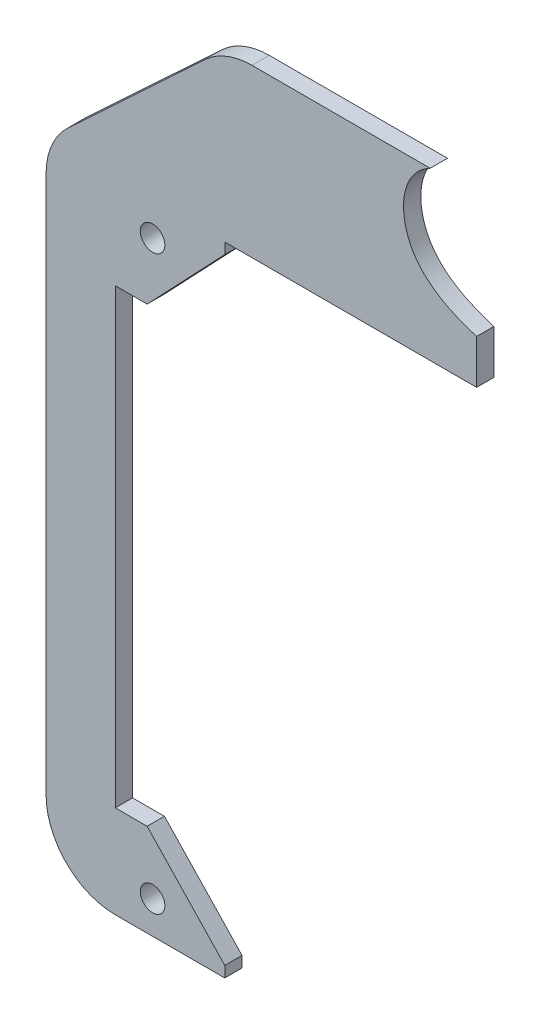
ISO-10303-21;
HEADER;
FILE_DESCRIPTION(('STEP AP214'),'2;1');
FILE_NAME('part.step','',(''),(''),'','','');
FILE_SCHEMA(('AUTOMOTIVE_DESIGN { 1 0 10303 214 1 1 1 1 }'));
ENDSEC;
DATA;
#1=APPLICATION_CONTEXT('core data for automotive mechanical design processes');
#2=APPLICATION_PROTOCOL_DEFINITION('international standard','automotive_design',2000,#1);
#3=PRODUCT_CONTEXT('',#1,'mechanical');
#4=PRODUCT('Part','Part','',(#3));
#5=PRODUCT_RELATED_PRODUCT_CATEGORY('part','',(#4));
#6=PRODUCT_DEFINITION_FORMATION('','',#4);
#7=PRODUCT_DEFINITION_CONTEXT('part definition',#1,'design');
#8=PRODUCT_DEFINITION('design','',#6,#7);
#9=PRODUCT_DEFINITION_SHAPE('','',#8);
#10=(LENGTH_UNIT() NAMED_UNIT(*) SI_UNIT(.MILLI.,.METRE.));
#11=(NAMED_UNIT(*) PLANE_ANGLE_UNIT() SI_UNIT($,.RADIAN.));
#12=(NAMED_UNIT(*) SI_UNIT($,.STERADIAN.) SOLID_ANGLE_UNIT());
#13=UNCERTAINTY_MEASURE_WITH_UNIT(LENGTH_MEASURE(1.E-05),#10,'distance_accuracy_value','');
#14=(GEOMETRIC_REPRESENTATION_CONTEXT(3) GLOBAL_UNCERTAINTY_ASSIGNED_CONTEXT((#13)) GLOBAL_UNIT_ASSIGNED_CONTEXT((#10,
#11,#12)) REPRESENTATION_CONTEXT('',''));
#15=CARTESIAN_POINT('',(0.,0.,0.));
#16=DIRECTION('',(0.,0.,1.));
#17=DIRECTION('',(1.,0.,0.));
#18=AXIS2_PLACEMENT_3D('',#15,#16,#17);
#19=CARTESIAN_POINT('',(0.,0.,3.17499999999997));
#20=DIRECTION('',(0.,0.,-1.));
#21=DIRECTION('',(-1.,0.,0.));
#22=AXIS2_PLACEMENT_3D('',#19,#20,#21);
#23=PLANE('',#22);
#24=DIRECTION('',(0.,1.,0.));
#25=VECTOR('',#24,1.);
#26=CARTESIAN_POINT('',(-497.05,1.49999999999986,3.17499999999998));
#27=LINE('',#26,#25);
#28=CARTESIAN_POINT('',(-497.05,14.1999999999999,3.17499999999998));
#29=VERTEX_POINT('',#28);
#30=CARTESIAN_POINT('',(-497.05,112.977053723609,3.17499999999998));
#31=VERTEX_POINT('',#30);
#32=EDGE_CURVE('E329',#29,#31,#27,.T.);
#33=ORIENTED_EDGE('',*,*,#32,.F.);
#34=CARTESIAN_POINT('',(-484.35,14.1999999999999,3.17499999999997));
#35=DIRECTION('',(0.,0.,-1.));
#36=DIRECTION('',(-1.,0.,0.));
#37=AXIS2_PLACEMENT_3D('',#34,#35,#36);
#38=CIRCLE('',#37,12.7);
#39=CARTESIAN_POINT('',(-484.35,1.49999999999986,3.17499999999997));
#40=VERTEX_POINT('',#39);
#41=EDGE_CURVE('E519',#29,#40,#38,.F.);
#42=ORIENTED_EDGE('',*,*,#41,.T.);
#43=DIRECTION('',(-1.,0.,0.));
#44=VECTOR('',#43,1.);
#45=CARTESIAN_POINT('',(-490.,1.49999999999986,3.17499999999997));
#46=LINE('',#45,#44);
#47=CARTESIAN_POINT('',(-464.25,1.49999999999986,3.17499999999997));
#48=VERTEX_POINT('',#47);
#49=EDGE_CURVE('E498',#48,#40,#46,.T.);
#50=ORIENTED_EDGE('',*,*,#49,.F.);
#51=DIRECTION('',(0.,-1.,0.));
#52=VECTOR('',#51,1.);
#53=CARTESIAN_POINT('',(-464.25,3.49999999999986,3.17499999999997));
#54=LINE('',#53,#52);
#55=CARTESIAN_POINT('',(-464.25,3.49999999999986,3.17499999999997));
#56=VERTEX_POINT('',#55);
#57=EDGE_CURVE('E437',#56,#48,#54,.T.);
#58=ORIENTED_EDGE('',*,*,#57,.F.);
#59=DIRECTION('',(-0.688749461914693,0.724999433594414,0.));
#60=VECTOR('',#59,1.);
#61=CARTESIAN_POINT('',(-464.25,3.49999999999986,3.17499999999997));
#62=LINE('',#61,#60);
#63=CARTESIAN_POINT('',(-478.5,18.4999999999999,3.17499999999997));
#64=VERTEX_POINT('',#63);
#65=EDGE_CURVE('E452',#56,#64,#62,.T.);
#66=ORIENTED_EDGE('',*,*,#65,.T.);
#67=DIRECTION('',(-1.,0.,0.));
#68=VECTOR('',#67,1.);
#69=CARTESIAN_POINT('',(-478.5,18.4999999999999,3.17499999999997));
#70=LINE('',#69,#68);
#71=CARTESIAN_POINT('',(-484.35,18.4999999999999,3.17499999999997));
#72=VERTEX_POINT('',#71);
#73=EDGE_CURVE('E466',#64,#72,#70,.T.);
#74=ORIENTED_EDGE('',*,*,#73,.T.);
#75=DIRECTION('',(0.,1.,0.));
#76=VECTOR('',#75,1.);
#77=CARTESIAN_POINT('',(-484.35,18.4999999999999,3.17499999999997));
#78=LINE('',#77,#76);
#79=CARTESIAN_POINT('',(-484.35,101.5,3.17499999999997));
#80=VERTEX_POINT('',#79);
#81=EDGE_CURVE('E398',#72,#80,#78,.T.);
#82=ORIENTED_EDGE('',*,*,#81,.T.);
#83=DIRECTION('',(1.,0.,0.));
#84=VECTOR('',#83,1.);
#85=CARTESIAN_POINT('',(-484.35,101.5,3.17499999999997));
#86=LINE('',#85,#84);
#87=CARTESIAN_POINT('',(-478.5,101.5,3.17499999999997));
#88=VERTEX_POINT('',#87);
#89=EDGE_CURVE('E394',#80,#88,#86,.T.);
#90=ORIENTED_EDGE('',*,*,#89,.T.);
#91=DIRECTION('',(0.688749461914693,0.724999433594414,0.));
#92=VECTOR('',#91,1.);
#93=CARTESIAN_POINT('',(-478.5,101.5,3.17499999999997));
#94=LINE('',#93,#92);
#95=CARTESIAN_POINT('',(-464.25,116.5,3.17499999999997));
#96=VERTEX_POINT('',#95);
#97=EDGE_CURVE('E410',#88,#96,#94,.T.);
#98=ORIENTED_EDGE('',*,*,#97,.T.);
#99=DIRECTION('',(0.,1.,0.));
#100=VECTOR('',#99,1.);
#101=CARTESIAN_POINT('',(-464.25,116.5,3.17499999999997));
#102=LINE('',#101,#100);
#103=CARTESIAN_POINT('',(-464.25,118.5,3.17499999999999));
#104=VERTEX_POINT('',#103);
#105=EDGE_CURVE('E417',#96,#104,#102,.T.);
#106=ORIENTED_EDGE('',*,*,#105,.T.);
#107=DIRECTION('',(-1.,0.,0.));
#108=VECTOR('',#107,1.);
#109=CARTESIAN_POINT('',(-422.34,118.5,3.17499999999999));
#110=LINE('',#109,#108);
#111=CARTESIAN_POINT('',(-418.022,118.5,3.17499999999999));
#112=VERTEX_POINT('',#111);
#113=EDGE_CURVE('E379',#112,#104,#110,.T.);
#114=ORIENTED_EDGE('',*,*,#113,.F.);
#115=DIRECTION('',(0.,-1.,0.));
#116=VECTOR('',#115,1.);
#117=CARTESIAN_POINT('',(-418.022,149.079761952969,3.17499999999998));
#118=LINE('',#117,#116);
#119=CARTESIAN_POINT('',(-418.022,126.606320752643,3.17499999999999));
#120=VERTEX_POINT('',#119);
#121=EDGE_CURVE('E343',#120,#112,#118,.T.);
#122=ORIENTED_EDGE('',*,*,#121,.F.);
#123=CARTESIAN_POINT('',(-426.539082164766,149.079761952969,3.17499999999997));
#124=CARTESIAN_POINT('',(-432.363764658075,146.022941569104,3.17499999999997));
#125=CARTESIAN_POINT('',(-432.707687459732,132.592685738179,3.17499999999997));
#126=CARTESIAN_POINT('',(-422.20678675676,127.841281747163,3.17499999999997));
#127=CARTESIAN_POINT('',(-418.022,126.606320752643,3.17499999999997));
#128=B_SPLINE_CURVE_WITH_KNOTS('',3,(#123,#124,#125,#126,#127),.UNSPECIFIED.,.F.,.F.,(4,1,4),
(0.,0.554929180984776,1.),.UNSPECIFIED.);
#129=CARTESIAN_POINT('',(-426.539082164766,149.079761952969,3.17499999999997));
#130=VERTEX_POINT('',#129);
#131=EDGE_CURVE('E334',#130,#120,#128,.T.);
#132=ORIENTED_EDGE('',*,*,#131,.F.);
#133=DIRECTION('',(1.,0.,0.));
#134=VECTOR('',#133,1.);
#135=CARTESIAN_POINT('',(0.,149.079761952969,3.17499999999999));
#136=LINE('',#135,#134);
#137=CARTESIAN_POINT('',(-459.248142402038,149.079761952969,3.17499999999998));
#138=VERTEX_POINT('',#137);
#139=EDGE_CURVE('E321',#138,#130,#136,.T.);
#140=ORIENTED_EDGE('',*,*,#139,.F.);
#141=CARTESIAN_POINT('',(-459.248142402038,136.379761952969,3.17499999999997));
#142=DIRECTION('',(0.,0.,-1.));
#143=DIRECTION('',(-1.,0.,0.));
#144=AXIS2_PLACEMENT_3D('',#141,#142,#143);
#145=CIRCLE('',#144,12.7);
#146=CARTESIAN_POINT('',(-467.908501623736,145.668904978628,3.17499999999997));
#147=VERTEX_POINT('',#146);
#148=EDGE_CURVE('E517',#138,#147,#145,.F.);
#149=ORIENTED_EDGE('',*,*,#148,.T.);
#150=DIRECTION('',(0.731428584697509,0.681918048952657,0.));
#151=VECTOR('',#150,1.);
#152=CARTESIAN_POINT('',(-497.05,118.5,3.17499999999997));
#153=LINE('',#152,#151);
#154=CARTESIAN_POINT('',(-493.010359221699,122.266196749267,3.17499999999997));
#155=VERTEX_POINT('',#154);
#156=EDGE_CURVE('E344',#155,#147,#153,.T.);
#157=ORIENTED_EDGE('',*,*,#156,.F.);
#158=CARTESIAN_POINT('',(-484.35,112.977053723609,3.17499999999997));
#159=DIRECTION('',(0.,0.,-1.));
#160=DIRECTION('',(-1.,0.,0.));
#161=AXIS2_PLACEMENT_3D('',#158,#159,#160);
#162=CIRCLE('',#161,12.7);
#163=EDGE_CURVE('E515',#155,#31,#162,.F.);
#164=ORIENTED_EDGE('',*,*,#163,.T.);
#165=EDGE_LOOP('',(#33,#42,#50,#58,#66,#74,#82,#90,#98,#106,#114,#122,#132,#140,#149,#157,#164));
#166=FACE_BOUND('',#165,.T.);
#167=CARTESIAN_POINT('',(-477.5,7.49999999999986,3.175));
#168=DIRECTION('',(0.,0.,1.));
#169=DIRECTION('',(1.,0.,0.));
#170=AXIS2_PLACEMENT_3D('',#167,#168,#169);
#171=CIRCLE('',#170,2.24999999999995);
#172=CARTESIAN_POINT('',(-475.25,7.49999999999986,3.175));
#173=VERTEX_POINT('',#172);
#174=EDGE_CURVE('E385',#173,#173,#171,.T.);
#175=ORIENTED_EDGE('',*,*,#174,.F.);
#176=EDGE_LOOP('',(#175));
#177=FACE_BOUND('',#176,.T.);
#178=CARTESIAN_POINT('',(-477.5,112.5,3.175));
#179=DIRECTION('',(0.,0.,1.));
#180=DIRECTION('',(1.,0.,0.));
#181=AXIS2_PLACEMENT_3D('',#178,#179,#180);
#182=CIRCLE('',#181,2.24999999999995);
#183=CARTESIAN_POINT('',(-475.25,112.5,3.175));
#184=VERTEX_POINT('',#183);
#185=EDGE_CURVE('E391',#184,#184,#182,.T.);
#186=ORIENTED_EDGE('',*,*,#185,.F.);
#187=EDGE_LOOP('',(#186));
#188=FACE_BOUND('',#187,.T.);
#189=ADVANCED_FACE('F202',(#166,#177,#188),#23,.F.);
#190=CARTESIAN_POINT('',(0.,0.,0.));
#191=DIRECTION('',(0.,0.,-1.));
#192=DIRECTION('',(-1.,0.,0.));
#193=AXIS2_PLACEMENT_3D('',#190,#191,#192);
#194=PLANE('',#193);
#195=DIRECTION('',(-1.,0.,0.));
#196=VECTOR('',#195,1.);
#197=CARTESIAN_POINT('',(-490.,1.49999999999986,0.));
#198=LINE('',#197,#196);
#199=CARTESIAN_POINT('',(-464.25,1.49999999999986,0.));
#200=VERTEX_POINT('',#199);
#201=CARTESIAN_POINT('',(-484.35,1.49999999999986,0.));
#202=VERTEX_POINT('',#201);
#203=EDGE_CURVE('E494',#200,#202,#198,.T.);
#204=ORIENTED_EDGE('',*,*,#203,.T.);
#205=CARTESIAN_POINT('',(-484.35,14.1999999999999,0.));
#206=DIRECTION('',(0.,0.,-1.));
#207=DIRECTION('',(-1.,0.,0.));
#208=AXIS2_PLACEMENT_3D('',#205,#206,#207);
#209=CIRCLE('',#208,12.7);
#210=CARTESIAN_POINT('',(-497.05,14.1999999999999,0.));
#211=VERTEX_POINT('',#210);
#212=EDGE_CURVE('E525',#202,#211,#209,.T.);
#213=ORIENTED_EDGE('',*,*,#212,.T.);
#214=DIRECTION('',(0.,1.,0.));
#215=VECTOR('',#214,1.);
#216=CARTESIAN_POINT('',(-497.05,1.49999999999986,0.));
#217=LINE('',#216,#215);
#218=CARTESIAN_POINT('',(-497.05,112.977053723609,0.));
#219=VERTEX_POINT('',#218);
#220=EDGE_CURVE('E505',#211,#219,#217,.T.);
#221=ORIENTED_EDGE('',*,*,#220,.T.);
#222=CARTESIAN_POINT('',(-484.35,112.977053723609,0.));
#223=DIRECTION('',(0.,0.,-1.));
#224=DIRECTION('',(-1.,0.,0.));
#225=AXIS2_PLACEMENT_3D('',#222,#223,#224);
#226=CIRCLE('',#225,12.7);
#227=CARTESIAN_POINT('',(-493.010359221699,122.266196749267,0.));
#228=VERTEX_POINT('',#227);
#229=EDGE_CURVE('E223',#219,#228,#226,.T.);
#230=ORIENTED_EDGE('',*,*,#229,.T.);
#231=DIRECTION('',(-0.731428584697509,-0.681918048952657,0.));
#232=VECTOR('',#231,1.);
#233=CARTESIAN_POINT('',(-290.239087559389,311.311843649704,0.));
#234=LINE('',#233,#232);
#235=CARTESIAN_POINT('',(-467.908501623736,145.668904978628,0.));
#236=VERTEX_POINT('',#235);
#237=EDGE_CURVE('E361',#236,#228,#234,.T.);
#238=ORIENTED_EDGE('',*,*,#237,.F.);
#239=CARTESIAN_POINT('',(-459.248142402038,136.379761952969,0.));
#240=DIRECTION('',(0.,0.,-1.));
#241=DIRECTION('',(-1.,0.,0.));
#242=AXIS2_PLACEMENT_3D('',#239,#240,#241);
#243=CIRCLE('',#242,12.7);
#244=CARTESIAN_POINT('',(-459.248142402038,149.079761952969,0.));
#245=VERTEX_POINT('',#244);
#246=EDGE_CURVE('E217',#236,#245,#243,.T.);
#247=ORIENTED_EDGE('',*,*,#246,.T.);
#248=DIRECTION('',(-1.,0.,0.));
#249=VECTOR('',#248,1.);
#250=CARTESIAN_POINT('',(0.,149.079761952969,0.));
#251=LINE('',#250,#249);
#252=CARTESIAN_POINT('',(-426.539082164766,149.079761952969,1.45716771982052E-13));
#253=VERTEX_POINT('',#252);
#254=EDGE_CURVE('E330',#253,#245,#251,.T.);
#255=ORIENTED_EDGE('',*,*,#254,.F.);
#256=CARTESIAN_POINT('',(-426.539082164766,149.079761952969,0.));
#257=CARTESIAN_POINT('',(-432.363764658075,146.022941569104,0.));
#258=CARTESIAN_POINT('',(-432.707687459732,132.592685738179,0.));
#259=CARTESIAN_POINT('',(-422.20678675676,127.841281747163,0.));
#260=CARTESIAN_POINT('',(-418.022,126.606320752643,0.));
#261=B_SPLINE_CURVE_WITH_KNOTS('',3,(#256,#257,#258,#259,#260),.UNSPECIFIED.,.F.,.F.,(4,1,4),
(0.,0.554929180984776,1.),.UNSPECIFIED.);
#262=CARTESIAN_POINT('',(-418.022,126.606320752643,0.));
#263=VERTEX_POINT('',#262);
#264=EDGE_CURVE('E337',#263,#253,#261,.F.);
#265=ORIENTED_EDGE('',*,*,#264,.F.);
#266=DIRECTION('',(0.,1.,0.));
#267=VECTOR('',#266,1.);
#268=CARTESIAN_POINT('',(-418.022,118.5,0.));
#269=LINE('',#268,#267);
#270=CARTESIAN_POINT('',(-418.022,118.5,0.));
#271=VERTEX_POINT('',#270);
#272=EDGE_CURVE('E370',#271,#263,#269,.T.);
#273=ORIENTED_EDGE('',*,*,#272,.F.);
#274=DIRECTION('',(-1.,0.,0.));
#275=VECTOR('',#274,1.);
#276=CARTESIAN_POINT('',(-422.34,118.5,0.));
#277=LINE('',#276,#275);
#278=CARTESIAN_POINT('',(-464.25,118.5,0.));
#279=VERTEX_POINT('',#278);
#280=EDGE_CURVE('E376',#271,#279,#277,.T.);
#281=ORIENTED_EDGE('',*,*,#280,.T.);
#282=DIRECTION('',(0.,1.,0.));
#283=VECTOR('',#282,1.);
#284=CARTESIAN_POINT('',(-464.25,116.5,0.));
#285=LINE('',#284,#283);
#286=CARTESIAN_POINT('',(-464.25,116.5,0.));
#287=VERTEX_POINT('',#286);
#288=EDGE_CURVE('E416',#287,#279,#285,.T.);
#289=ORIENTED_EDGE('',*,*,#288,.F.);
#290=DIRECTION('',(0.688749461914693,0.724999433594414,0.));
#291=VECTOR('',#290,1.);
#292=CARTESIAN_POINT('',(-478.5,101.5,0.));
#293=LINE('',#292,#291);
#294=CARTESIAN_POINT('',(-478.5,101.5,0.));
#295=VERTEX_POINT('',#294);
#296=EDGE_CURVE('E407',#295,#287,#293,.T.);
#297=ORIENTED_EDGE('',*,*,#296,.F.);
#298=DIRECTION('',(1.,0.,0.));
#299=VECTOR('',#298,1.);
#300=CARTESIAN_POINT('',(-484.35,101.5,0.));
#301=LINE('',#300,#299);
#302=CARTESIAN_POINT('',(-484.35,101.5,0.));
#303=VERTEX_POINT('',#302);
#304=EDGE_CURVE('E399',#303,#295,#301,.T.);
#305=ORIENTED_EDGE('',*,*,#304,.F.);
#306=DIRECTION('',(0.,1.,0.));
#307=VECTOR('',#306,1.);
#308=CARTESIAN_POINT('',(-484.35,18.4999999999999,0.));
#309=LINE('',#308,#307);
#310=CARTESIAN_POINT('',(-484.35,18.4999999999999,0.));
#311=VERTEX_POINT('',#310);
#312=EDGE_CURVE('E474',#311,#303,#309,.T.);
#313=ORIENTED_EDGE('',*,*,#312,.F.);
#314=DIRECTION('',(-1.,0.,0.));
#315=VECTOR('',#314,1.);
#316=CARTESIAN_POINT('',(-478.5,18.4999999999999,0.));
#317=LINE('',#316,#315);
#318=CARTESIAN_POINT('',(-478.5,18.4999999999999,0.));
#319=VERTEX_POINT('',#318);
#320=EDGE_CURVE('E460',#319,#311,#317,.T.);
#321=ORIENTED_EDGE('',*,*,#320,.F.);
#322=DIRECTION('',(-0.688749461914693,0.724999433594414,0.));
#323=VECTOR('',#322,1.);
#324=CARTESIAN_POINT('',(-464.25,3.49999999999986,0.));
#325=LINE('',#324,#323);
#326=CARTESIAN_POINT('',(-464.25,3.49999999999986,0.));
#327=VERTEX_POINT('',#326);
#328=EDGE_CURVE('E446',#327,#319,#325,.T.);
#329=ORIENTED_EDGE('',*,*,#328,.F.);
#330=DIRECTION('',(0.,-1.,0.));
#331=VECTOR('',#330,1.);
#332=CARTESIAN_POINT('',(-464.25,3.49999999999986,0.));
#333=LINE('',#332,#331);
#334=EDGE_CURVE('E434',#327,#200,#333,.T.);
#335=ORIENTED_EDGE('',*,*,#334,.T.);
#336=EDGE_LOOP('',(#204,#213,#221,#230,#238,#247,#255,#265,#273,#281,#289,#297,#305,#313,#321,
#329,#335));
#337=FACE_BOUND('',#336,.T.);
#338=CARTESIAN_POINT('',(-477.5,7.49999999999986,0.));
#339=DIRECTION('',(0.,0.,1.));
#340=DIRECTION('',(1.,0.,0.));
#341=AXIS2_PLACEMENT_3D('',#338,#339,#340);
#342=CIRCLE('',#341,2.24999999999995);
#343=CARTESIAN_POINT('',(-475.25,7.49999999999986,0.));
#344=VERTEX_POINT('',#343);
#345=EDGE_CURVE('E382',#344,#344,#342,.T.);
#346=ORIENTED_EDGE('',*,*,#345,.T.);
#347=EDGE_LOOP('',(#346));
#348=FACE_BOUND('',#347,.T.);
#349=CARTESIAN_POINT('',(-477.5,112.5,0.));
#350=DIRECTION('',(0.,0.,1.));
#351=DIRECTION('',(1.,0.,0.));
#352=AXIS2_PLACEMENT_3D('',#349,#350,#351);
#353=CIRCLE('',#352,2.24999999999995);
#354=CARTESIAN_POINT('',(-475.25,112.5,0.));
#355=VERTEX_POINT('',#354);
#356=EDGE_CURVE('E388',#355,#355,#353,.T.);
#357=ORIENTED_EDGE('',*,*,#356,.T.);
#358=EDGE_LOOP('',(#357));
#359=FACE_BOUND('',#358,.T.);
#360=ADVANCED_FACE('F536',(#337,#348,#359),#194,.T.);
#361=CARTESIAN_POINT('',(-490.,1.49999999999986,0.));
#362=DIRECTION('',(0.,1.,0.));
#363=DIRECTION('',(0.,0.,1.));
#364=AXIS2_PLACEMENT_3D('',#361,#362,#363);
#365=PLANE('',#364);
#366=ORIENTED_EDGE('',*,*,#49,.T.);
#367=DIRECTION('',(0.,0.,1.));
#368=VECTOR('',#367,1.);
#369=CARTESIAN_POINT('',(-484.35,1.49999999999986,0.));
#370=LINE('',#369,#368);
#371=EDGE_CURVE('E521',#40,#202,#370,.F.);
#372=ORIENTED_EDGE('',*,*,#371,.T.);
#373=ORIENTED_EDGE('',*,*,#203,.F.);
#374=DIRECTION('',(0.,0.,1.));
#375=VECTOR('',#374,1.);
#376=CARTESIAN_POINT('',(-464.25,1.49999999999986,0.));
#377=LINE('',#376,#375);
#378=EDGE_CURVE('E431',#200,#48,#377,.T.);
#379=ORIENTED_EDGE('',*,*,#378,.T.);
#380=EDGE_LOOP('',(#366,#372,#373,#379));
#381=FACE_BOUND('',#380,.T.);
#382=ADVANCED_FACE('F540',(#381),#365,.F.);
#383=CARTESIAN_POINT('',(-497.05,1.49999999999986,0.));
#384=DIRECTION('',(1.,0.,0.));
#385=DIRECTION('',(0.,0.,-1.));
#386=AXIS2_PLACEMENT_3D('',#383,#384,#385);
#387=PLANE('',#386);
#388=ORIENTED_EDGE('',*,*,#220,.F.);
#389=DIRECTION('',(0.,0.,1.));
#390=VECTOR('',#389,1.);
#391=CARTESIAN_POINT('',(-497.05,14.1999999999999,0.));
#392=LINE('',#391,#390);
#393=EDGE_CURVE('E512',#211,#29,#392,.T.);
#394=ORIENTED_EDGE('',*,*,#393,.T.);
#395=ORIENTED_EDGE('',*,*,#32,.T.);
#396=DIRECTION('',(0.,0.,1.));
#397=VECTOR('',#396,1.);
#398=CARTESIAN_POINT('',(-497.05,112.977053723609,0.));
#399=LINE('',#398,#397);
#400=EDGE_CURVE('E510',#31,#219,#399,.F.);
#401=ORIENTED_EDGE('',*,*,#400,.T.);
#402=EDGE_LOOP('',(#388,#394,#395,#401));
#403=FACE_BOUND('',#402,.T.);
#404=ADVANCED_FACE('F563',(#403),#387,.F.);
#405=CARTESIAN_POINT('',(0.,149.079761952969,0.));
#406=DIRECTION('',(0.,1.,0.));
#407=DIRECTION('',(0.,0.,1.));
#408=AXIS2_PLACEMENT_3D('',#405,#406,#407);
#409=PLANE('',#408);
#410=ORIENTED_EDGE('',*,*,#254,.T.);
#411=DIRECTION('',(0.,0.,-1.));
#412=VECTOR('',#411,1.);
#413=CARTESIAN_POINT('',(-459.248142402038,149.079761952969,3.17499999999998));
#414=LINE('',#413,#412);
#415=EDGE_CURVE('E12',#245,#138,#414,.F.);
#416=ORIENTED_EDGE('',*,*,#415,.T.);
#417=ORIENTED_EDGE('',*,*,#139,.T.);
#418=DIRECTION('',(0.,0.,1.));
#419=VECTOR('',#418,1.);
#420=CARTESIAN_POINT('',(-426.539082164766,149.079761952969,-1.90500000000003));
#421=LINE('',#420,#419);
#422=EDGE_CURVE('E324',#253,#130,#421,.T.);
#423=ORIENTED_EDGE('',*,*,#422,.F.);
#424=EDGE_LOOP('',(#410,#416,#417,#423));
#425=FACE_BOUND('',#424,.T.);
#426=ADVANCED_FACE('F323',(#425),#409,.T.);
#427=CARTESIAN_POINT('',(-464.25,116.5,0.));
#428=DIRECTION('',(1.,0.,0.));
#429=DIRECTION('',(0.,0.,-1.));
#430=AXIS2_PLACEMENT_3D('',#427,#428,#429);
#431=PLANE('',#430);
#432=ORIENTED_EDGE('',*,*,#288,.T.);
#433=DIRECTION('',(0.,0.,-1.));
#434=VECTOR('',#433,1.);
#435=CARTESIAN_POINT('',(-464.25,118.5,3.17499999999999));
#436=LINE('',#435,#434);
#437=EDGE_CURVE('E373',#104,#279,#436,.T.);
#438=ORIENTED_EDGE('',*,*,#437,.F.);
#439=ORIENTED_EDGE('',*,*,#105,.F.);
#440=DIRECTION('',(0.,0.,1.));
#441=VECTOR('',#440,1.);
#442=CARTESIAN_POINT('',(-464.25,116.5,0.));
#443=LINE('',#442,#441);
#444=EDGE_CURVE('E413',#287,#96,#443,.T.);
#445=ORIENTED_EDGE('',*,*,#444,.F.);
#446=EDGE_LOOP('',(#432,#438,#439,#445));
#447=FACE_BOUND('',#446,.T.);
#448=ADVANCED_FACE('F562',(#447),#431,.T.);
#449=CARTESIAN_POINT('',(-484.35,101.5,0.));
#450=DIRECTION('',(0.,-1.,0.));
#451=DIRECTION('',(0.,0.,-1.));
#452=AXIS2_PLACEMENT_3D('',#449,#450,#451);
#453=PLANE('',#452);
#454=ORIENTED_EDGE('',*,*,#89,.F.);
#455=DIRECTION('',(0.,0.,1.));
#456=VECTOR('',#455,1.);
#457=CARTESIAN_POINT('',(-484.35,101.5,0.));
#458=LINE('',#457,#456);
#459=EDGE_CURVE('E404',#303,#80,#458,.T.);
#460=ORIENTED_EDGE('',*,*,#459,.F.);
#461=ORIENTED_EDGE('',*,*,#304,.T.);
#462=DIRECTION('',(0.,0.,1.));
#463=VECTOR('',#462,1.);
#464=CARTESIAN_POINT('',(-478.5,101.5,0.));
#465=LINE('',#464,#463);
#466=EDGE_CURVE('E395',#295,#88,#465,.T.);
#467=ORIENTED_EDGE('',*,*,#466,.T.);
#468=EDGE_LOOP('',(#454,#460,#461,#467));
#469=FACE_BOUND('',#468,.T.);
#470=ADVANCED_FACE('F552',(#469),#453,.T.);
#471=CARTESIAN_POINT('',(-484.35,18.4999999999999,0.));
#472=DIRECTION('',(1.,0.,0.));
#473=DIRECTION('',(0.,1.,0.));
#474=AXIS2_PLACEMENT_3D('',#471,#472,#473);
#475=PLANE('',#474);
#476=ORIENTED_EDGE('',*,*,#81,.F.);
#477=DIRECTION('',(0.,0.,1.));
#478=VECTOR('',#477,1.);
#479=CARTESIAN_POINT('',(-484.35,18.4999999999999,0.));
#480=LINE('',#479,#478);
#481=EDGE_CURVE('E477',#311,#72,#480,.T.);
#482=ORIENTED_EDGE('',*,*,#481,.F.);
#483=ORIENTED_EDGE('',*,*,#312,.T.);
#484=ORIENTED_EDGE('',*,*,#459,.T.);
#485=EDGE_LOOP('',(#476,#482,#483,#484));
#486=FACE_BOUND('',#485,.T.);
#487=ADVANCED_FACE('F592',(#486),#475,.T.);
#488=CARTESIAN_POINT('',(-478.5,18.4999999999999,0.));
#489=DIRECTION('',(0.,1.,0.));
#490=DIRECTION('',(-1.,0.,0.));
#491=AXIS2_PLACEMENT_3D('',#488,#489,#490);
#492=PLANE('',#491);
#493=ORIENTED_EDGE('',*,*,#73,.F.);
#494=DIRECTION('',(0.,0.,1.));
#495=VECTOR('',#494,1.);
#496=CARTESIAN_POINT('',(-478.5,18.4999999999999,0.));
#497=LINE('',#496,#495);
#498=EDGE_CURVE('E463',#319,#64,#497,.T.);
#499=ORIENTED_EDGE('',*,*,#498,.F.);
#500=ORIENTED_EDGE('',*,*,#320,.T.);
#501=ORIENTED_EDGE('',*,*,#481,.T.);
#502=EDGE_LOOP('',(#493,#499,#500,#501));
#503=FACE_BOUND('',#502,.T.);
#504=ADVANCED_FACE('F588',(#503),#492,.T.);
#505=CARTESIAN_POINT('',(-464.25,3.49999999999986,0.));
#506=DIRECTION('',(0.724999433594414,0.688749461914693,0.));
#507=DIRECTION('',(-0.688749461914693,0.724999433594414,0.));
#508=AXIS2_PLACEMENT_3D('',#505,#506,#507);
#509=PLANE('',#508);
#510=ORIENTED_EDGE('',*,*,#65,.F.);
#511=DIRECTION('',(0.,0.,1.));
#512=VECTOR('',#511,1.);
#513=CARTESIAN_POINT('',(-464.25,3.49999999999986,0.));
#514=LINE('',#513,#512);
#515=EDGE_CURVE('E449',#327,#56,#514,.T.);
#516=ORIENTED_EDGE('',*,*,#515,.F.);
#517=ORIENTED_EDGE('',*,*,#328,.T.);
#518=ORIENTED_EDGE('',*,*,#498,.T.);
#519=EDGE_LOOP('',(#510,#516,#517,#518));
#520=FACE_BOUND('',#519,.T.);
#521=ADVANCED_FACE('F578',(#520),#509,.T.);
#522=CARTESIAN_POINT('',(-478.5,101.5,0.));
#523=DIRECTION('',(0.724999433594414,-0.688749461914693,0.));
#524=DIRECTION('',(0.688749461914693,0.724999433594414,0.));
#525=AXIS2_PLACEMENT_3D('',#522,#523,#524);
#526=PLANE('',#525);
#527=ORIENTED_EDGE('',*,*,#97,.F.);
#528=ORIENTED_EDGE('',*,*,#466,.F.);
#529=ORIENTED_EDGE('',*,*,#296,.T.);
#530=ORIENTED_EDGE('',*,*,#444,.T.);
#531=EDGE_LOOP('',(#527,#528,#529,#530));
#532=FACE_BOUND('',#531,.T.);
#533=ADVANCED_FACE('F575',(#532),#526,.T.);
#534=CARTESIAN_POINT('',(-464.25,3.49999999999986,0.));
#535=DIRECTION('',(-1.,0.,0.));
#536=DIRECTION('',(0.,-1.,0.));
#537=AXIS2_PLACEMENT_3D('',#534,#535,#536);
#538=PLANE('',#537);
#539=ORIENTED_EDGE('',*,*,#57,.T.);
#540=ORIENTED_EDGE('',*,*,#378,.F.);
#541=ORIENTED_EDGE('',*,*,#334,.F.);
#542=ORIENTED_EDGE('',*,*,#515,.T.);
#543=EDGE_LOOP('',(#539,#540,#541,#542));
#544=FACE_BOUND('',#543,.T.);
#545=ADVANCED_FACE('F550',(#544),#538,.F.);
#546=CARTESIAN_POINT('',(-477.5,112.5,0.));
#547=DIRECTION('',(0.,0.,1.));
#548=DIRECTION('',(1.,0.,0.));
#549=AXIS2_PLACEMENT_3D('',#546,#547,#548);
#550=CYLINDRICAL_SURFACE('',#549,2.24999999999995);
#551=ORIENTED_EDGE('',*,*,#356,.F.);
#552=EDGE_LOOP('',(#551));
#553=FACE_BOUND('',#552,.T.);
#554=ORIENTED_EDGE('',*,*,#185,.T.);
#555=EDGE_LOOP('',(#554));
#556=FACE_BOUND('',#555,.T.);
#557=ADVANCED_FACE('F546',(#553,#556),#550,.F.);
#558=CARTESIAN_POINT('',(-477.5,7.49999999999986,0.));
#559=DIRECTION('',(0.,0.,1.));
#560=DIRECTION('',(1.,0.,0.));
#561=AXIS2_PLACEMENT_3D('',#558,#559,#560);
#562=CYLINDRICAL_SURFACE('',#561,2.24999999999995);
#563=ORIENTED_EDGE('',*,*,#345,.F.);
#564=EDGE_LOOP('',(#563));
#565=FACE_BOUND('',#564,.T.);
#566=ORIENTED_EDGE('',*,*,#174,.T.);
#567=EDGE_LOOP('',(#566));
#568=FACE_BOUND('',#567,.T.);
#569=ADVANCED_FACE('F549',(#565,#568),#562,.F.);
#570=CARTESIAN_POINT('',(-422.34,118.5,3.17499999999999));
#571=DIRECTION('',(0.,1.,0.));
#572=DIRECTION('',(-1.,0.,0.));
#573=AXIS2_PLACEMENT_3D('',#570,#571,#572);
#574=PLANE('',#573);
#575=ORIENTED_EDGE('',*,*,#437,.T.);
#576=ORIENTED_EDGE('',*,*,#280,.F.);
#577=DIRECTION('',(0.,0.,-1.));
#578=VECTOR('',#577,1.);
#579=CARTESIAN_POINT('',(-418.022,118.5,3.17499999999999));
#580=LINE('',#579,#578);
#581=EDGE_CURVE('E367',#112,#271,#580,.T.);
#582=ORIENTED_EDGE('',*,*,#581,.F.);
#583=ORIENTED_EDGE('',*,*,#113,.T.);
#584=EDGE_LOOP('',(#575,#576,#582,#583));
#585=FACE_BOUND('',#584,.T.);
#586=ADVANCED_FACE('F602',(#585),#574,.F.);
#587=CARTESIAN_POINT('',(-418.022,0.,0.));
#588=DIRECTION('',(1.,0.,0.));
#589=DIRECTION('',(0.,0.,-1.));
#590=AXIS2_PLACEMENT_3D('',#587,#588,#589);
#591=PLANE('',#590);
#592=DIRECTION('',(0.,0.,1.));
#593=VECTOR('',#592,1.);
#594=CARTESIAN_POINT('',(-418.022,126.606320752643,-1.90500000000003));
#595=LINE('',#594,#593);
#596=EDGE_CURVE('E497',#120,#263,#595,.F.);
#597=ORIENTED_EDGE('',*,*,#596,.F.);
#598=ORIENTED_EDGE('',*,*,#121,.T.);
#599=ORIENTED_EDGE('',*,*,#581,.T.);
#600=ORIENTED_EDGE('',*,*,#272,.T.);
#601=EDGE_LOOP('',(#597,#598,#599,#600));
#602=FACE_BOUND('',#601,.T.);
#603=ADVANCED_FACE('F606',(#602),#591,.T.);
#604=CARTESIAN_POINT('',(-426.539082164766,149.079761952969,-1.90500000000003));
#605=CARTESIAN_POINT('',(-432.363764658075,146.022941569104,-1.90500000000003));
#606=CARTESIAN_POINT('',(-432.707687459732,132.592685738179,-1.90500000000003));
#607=CARTESIAN_POINT('',(-422.20678675676,127.841281747163,-1.90500000000003));
#608=CARTESIAN_POINT('',(-418.022,126.606320752643,-1.90500000000003));
#609=B_SPLINE_CURVE_WITH_KNOTS('',3,(#604,#605,#606,#607,#608),.UNSPECIFIED.,.F.,.F.,(4,1,4),
(0.,0.554929180984776,1.),.UNSPECIFIED.);
#610=DIRECTION('',(0.,0.,1.));
#611=VECTOR('',#610,1.);
#612=SURFACE_OF_LINEAR_EXTRUSION('',#609,#611);
#613=ORIENTED_EDGE('',*,*,#264,.T.);
#614=ORIENTED_EDGE('',*,*,#422,.T.);
#615=ORIENTED_EDGE('',*,*,#131,.T.);
#616=ORIENTED_EDGE('',*,*,#596,.T.);
#617=EDGE_LOOP('',(#613,#614,#615,#616));
#618=FACE_BOUND('',#617,.T.);
#619=ADVANCED_FACE('F333',(#618),#612,.F.);
#620=CARTESIAN_POINT('',(-497.05,118.5,-1.90500000000003));
#621=DIRECTION('',(0.681918048952657,-0.731428584697509,0.));
#622=DIRECTION('',(0.731428584697509,0.681918048952657,0.));
#623=AXIS2_PLACEMENT_3D('',#620,#621,#622);
#624=PLANE('',#623);
#625=ORIENTED_EDGE('',*,*,#156,.T.);
#626=DIRECTION('',(0.,0.,-1.));
#627=VECTOR('',#626,1.);
#628=CARTESIAN_POINT('',(-467.908501623736,145.668904978628,0.));
#629=LINE('',#628,#627);
#630=EDGE_CURVE('E210',#147,#236,#629,.T.);
#631=ORIENTED_EDGE('',*,*,#630,.T.);
#632=ORIENTED_EDGE('',*,*,#237,.T.);
#633=DIRECTION('',(0.,0.,1.));
#634=VECTOR('',#633,1.);
#635=CARTESIAN_POINT('',(-493.010359221699,122.266196749267,-1.90500000000003));
#636=LINE('',#635,#634);
#637=EDGE_CURVE('E527',#228,#155,#636,.T.);
#638=ORIENTED_EDGE('',*,*,#637,.T.);
#639=EDGE_LOOP('',(#625,#631,#632,#638));
#640=FACE_BOUND('',#639,.T.);
#641=ADVANCED_FACE('F532',(#640),#624,.F.);
#642=CARTESIAN_POINT('',(-484.35,14.1999999999999,0.));
#643=DIRECTION('',(0.,0.,1.));
#644=DIRECTION('',(1.,0.,0.));
#645=AXIS2_PLACEMENT_3D('',#642,#643,#644);
#646=CYLINDRICAL_SURFACE('',#645,12.7);
#647=ORIENTED_EDGE('',*,*,#212,.F.);
#648=ORIENTED_EDGE('',*,*,#371,.F.);
#649=ORIENTED_EDGE('',*,*,#41,.F.);
#650=ORIENTED_EDGE('',*,*,#393,.F.);
#651=EDGE_LOOP('',(#647,#648,#649,#650));
#652=FACE_BOUND('',#651,.T.);
#653=ADVANCED_FACE('F613',(#652),#646,.T.);
#654=CARTESIAN_POINT('',(-459.248142402038,136.379761952969,-1.90500000000003));
#655=DIRECTION('',(0.,0.,1.));
#656=DIRECTION('',(1.,0.,0.));
#657=AXIS2_PLACEMENT_3D('',#654,#655,#656);
#658=CYLINDRICAL_SURFACE('',#657,12.7);
#659=ORIENTED_EDGE('',*,*,#148,.F.);
#660=ORIENTED_EDGE('',*,*,#415,.F.);
#661=ORIENTED_EDGE('',*,*,#246,.F.);
#662=ORIENTED_EDGE('',*,*,#630,.F.);
#663=EDGE_LOOP('',(#659,#660,#661,#662));
#664=FACE_BOUND('',#663,.T.);
#665=ADVANCED_FACE('F630',(#664),#658,.T.);
#666=CARTESIAN_POINT('',(-484.35,112.977053723609,-1.90500000000003));
#667=DIRECTION('',(0.,0.,1.));
#668=DIRECTION('',(1.,0.,0.));
#669=AXIS2_PLACEMENT_3D('',#666,#667,#668);
#670=CYLINDRICAL_SURFACE('',#669,12.7);
#671=ORIENTED_EDGE('',*,*,#229,.F.);
#672=ORIENTED_EDGE('',*,*,#400,.F.);
#673=ORIENTED_EDGE('',*,*,#163,.F.);
#674=ORIENTED_EDGE('',*,*,#637,.F.);
#675=EDGE_LOOP('',(#671,#672,#673,#674));
#676=FACE_BOUND('',#675,.T.);
#677=ADVANCED_FACE('F204',(#676),#670,.T.);
#678=CLOSED_SHELL('',(#189,#360,#382,#404,#426,#448,#470,#487,#504,#521,#533,#545,#557,#569,
#586,#603,#619,#641,#653,#665,#677));
#679=MANIFOLD_SOLID_BREP('B2',#678);
#680=ADVANCED_BREP_SHAPE_REPRESENTATION('',(#18,#679),#14);
#681=SHAPE_DEFINITION_REPRESENTATION(#9,#680);
ENDSEC;
END-ISO-10303-21;
